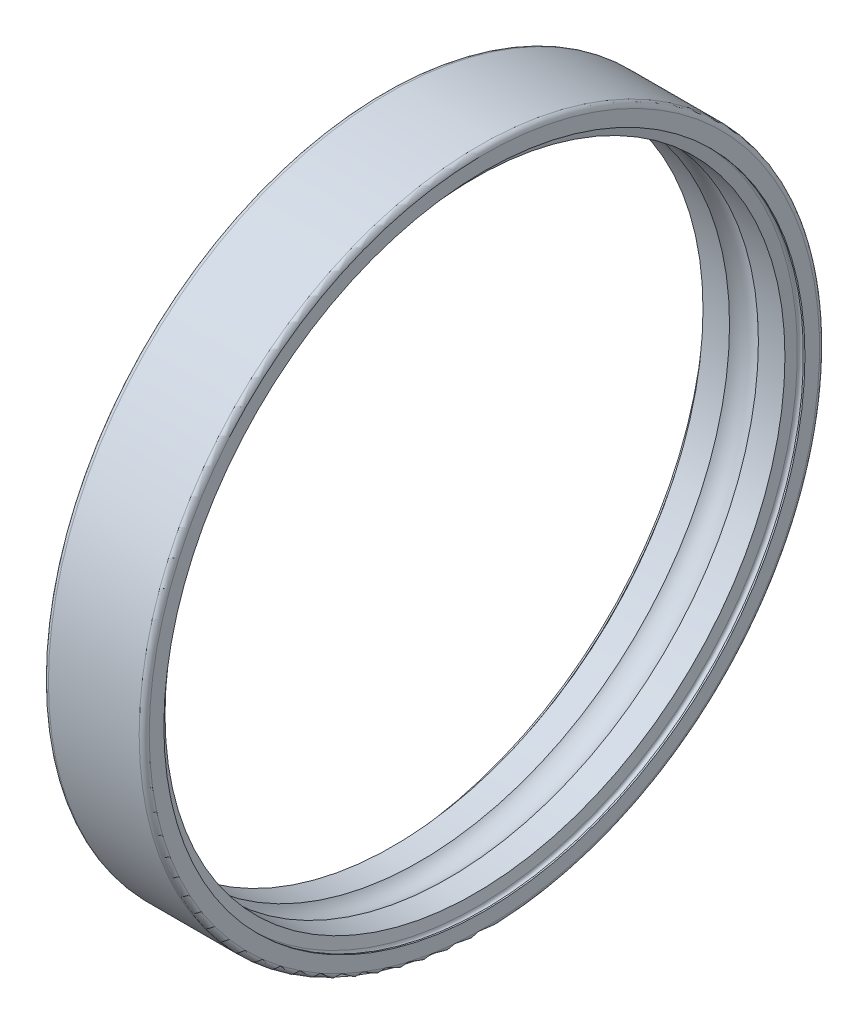
ISO-10303-21;
HEADER;
FILE_DESCRIPTION(('STEP AP214'),'2;1');
FILE_NAME('part.step','',(''),(''),'','','');
FILE_SCHEMA(('AUTOMOTIVE_DESIGN { 1 0 10303 214 1 1 1 1 }'));
ENDSEC;
DATA;
#1=APPLICATION_CONTEXT('core data for automotive mechanical design processes');
#2=APPLICATION_PROTOCOL_DEFINITION('international standard','automotive_design',2000,#1);
#3=PRODUCT_CONTEXT('',#1,'mechanical');
#4=PRODUCT('Part','Part','',(#3));
#5=PRODUCT_RELATED_PRODUCT_CATEGORY('part','',(#4));
#6=PRODUCT_DEFINITION_FORMATION('','',#4);
#7=PRODUCT_DEFINITION_CONTEXT('part definition',#1,'design');
#8=PRODUCT_DEFINITION('design','',#6,#7);
#9=PRODUCT_DEFINITION_SHAPE('','',#8);
#10=(LENGTH_UNIT() NAMED_UNIT(*) SI_UNIT(.MILLI.,.METRE.));
#11=(NAMED_UNIT(*) PLANE_ANGLE_UNIT() SI_UNIT($,.RADIAN.));
#12=(NAMED_UNIT(*) SI_UNIT($,.STERADIAN.) SOLID_ANGLE_UNIT());
#13=UNCERTAINTY_MEASURE_WITH_UNIT(LENGTH_MEASURE(1.E-05),#10,'distance_accuracy_value','');
#14=(GEOMETRIC_REPRESENTATION_CONTEXT(3) GLOBAL_UNCERTAINTY_ASSIGNED_CONTEXT((#13)) GLOBAL_UNIT_ASSIGNED_CONTEXT((#10,
#11,#12)) REPRESENTATION_CONTEXT('',''));
#15=CARTESIAN_POINT('',(0.,0.,0.));
#16=DIRECTION('',(0.,0.,1.));
#17=DIRECTION('',(1.,0.,0.));
#18=AXIS2_PLACEMENT_3D('',#15,#16,#17);
#19=CARTESIAN_POINT('',(0.,-13.5470653717791,-13.3));
#20=DIRECTION('',(-1.,0.,0.));
#21=DIRECTION('',(0.,0.,1.));
#22=AXIS2_PLACEMENT_3D('',#19,#20,#21);
#23=PLANE('',#22);
#24=CARTESIAN_POINT('',(0.,0.,0.));
#25=DIRECTION('',(-1.,0.,0.));
#26=DIRECTION('',(0.,0.,-1.));
#27=AXIS2_PLACEMENT_3D('',#24,#25,#26);
#28=CIRCLE('',#27,13.3);
#29=CARTESIAN_POINT('',(0.,0.,-13.3));
#30=VERTEX_POINT('',#29);
#31=EDGE_CURVE('E62',#30,#30,#28,.F.);
#32=ORIENTED_EDGE('',*,*,#31,.F.);
#33=EDGE_LOOP('',(#32));
#34=FACE_BOUND('',#33,.T.);
#35=CARTESIAN_POINT('',(0.,0.,0.));
#36=DIRECTION('',(1.,0.,0.));
#37=DIRECTION('',(0.,0.,1.));
#38=AXIS2_PLACEMENT_3D('',#35,#36,#37);
#39=CIRCLE('',#38,12.72);
#40=CARTESIAN_POINT('',(0.,0.,12.72));
#41=VERTEX_POINT('',#40);
#42=EDGE_CURVE('E59',#41,#41,#39,.T.);
#43=ORIENTED_EDGE('',*,*,#42,.T.);
#44=EDGE_LOOP('',(#43));
#45=FACE_BOUND('',#44,.T.);
#46=ADVANCED_FACE('F15',(#34,#45),#23,.T.);
#47=CARTESIAN_POINT('',(4.,-13.5470653486385,13.3));
#48=DIRECTION('',(1.,0.,0.));
#49=DIRECTION('',(0.,0.,-1.));
#50=AXIS2_PLACEMENT_3D('',#47,#48,#49);
#51=PLANE('',#50);
#52=CARTESIAN_POINT('',(4.,0.,0.));
#53=DIRECTION('',(1.,0.,0.));
#54=DIRECTION('',(0.,-1.16857340846483E-09,1.));
#55=AXIS2_PLACEMENT_3D('',#52,#53,#54);
#56=CIRCLE('',#55,13.3000000098838);
#57=CARTESIAN_POINT('',(4.,-1.55420263441322E-08,13.3000000098838));
#58=VERTEX_POINT('',#57);
#59=EDGE_CURVE('E56',#58,#58,#56,.T.);
#60=ORIENTED_EDGE('',*,*,#59,.T.);
#61=EDGE_LOOP('',(#60));
#62=FACE_BOUND('',#61,.T.);
#63=CARTESIAN_POINT('',(4.,0.,0.));
#64=DIRECTION('',(-1.,0.,0.));
#65=DIRECTION('',(0.,0.,-1.));
#66=AXIS2_PLACEMENT_3D('',#63,#64,#65);
#67=CIRCLE('',#66,12.72);
#68=CARTESIAN_POINT('',(4.,0.,-12.72));
#69=VERTEX_POINT('',#68);
#70=EDGE_CURVE('E53',#69,#69,#67,.F.);
#71=ORIENTED_EDGE('',*,*,#70,.F.);
#72=EDGE_LOOP('',(#71));
#73=FACE_BOUND('',#72,.T.);
#74=ADVANCED_FACE('F70',(#62,#73),#51,.T.);
#75=CARTESIAN_POINT('',(50.,0.,0.));
#76=DIRECTION('',(1.,0.,0.));
#77=DIRECTION('',(0.,0.,1.));
#78=AXIS2_PLACEMENT_3D('',#75,#76,#77);
#79=CYLINDRICAL_SURFACE('',#78,12.72);
#80=CARTESIAN_POINT('',(0.0599999999999952,0.,0.));
#81=DIRECTION('',(1.,0.,0.));
#82=DIRECTION('',(0.,0.,1.));
#83=AXIS2_PLACEMENT_3D('',#80,#81,#82);
#84=CIRCLE('',#83,12.72);
#85=CARTESIAN_POINT('',(0.0599999999999952,0.,12.72));
#86=VERTEX_POINT('',#85);
#87=EDGE_CURVE('E50',#86,#86,#84,.T.);
#88=ORIENTED_EDGE('',*,*,#87,.T.);
#89=EDGE_LOOP('',(#88));
#90=FACE_BOUND('',#89,.T.);
#91=ORIENTED_EDGE('',*,*,#42,.F.);
#92=EDGE_LOOP('',(#91));
#93=FACE_BOUND('',#92,.T.);
#94=ADVANCED_FACE('F74',(#90,#93),#79,.F.);
#95=CARTESIAN_POINT('',(0.18,0.,0.));
#96=DIRECTION('',(1.,0.,0.));
#97=DIRECTION('',(0.,0.,1.));
#98=AXIS2_PLACEMENT_3D('',#95,#96,#97);
#99=TOROIDAL_SURFACE('',#98,12.72,0.12);
#100=ORIENTED_EDGE('',*,*,#87,.F.);
#101=EDGE_LOOP('',(#100));
#102=FACE_BOUND('',#101,.T.);
#103=CARTESIAN_POINT('',(0.3,0.,0.));
#104=DIRECTION('',(1.,0.,0.));
#105=DIRECTION('',(0.,-1.92331361607703E-10,1.));
#106=AXIS2_PLACEMENT_3D('',#103,#104,#105);
#107=CIRCLE('',#106,12.72);
#108=CARTESIAN_POINT('',(0.3,-2.44645491964999E-09,12.72));
#109=VERTEX_POINT('',#108);
#110=EDGE_CURVE('E47',#109,#109,#107,.T.);
#111=ORIENTED_EDGE('',*,*,#110,.T.);
#112=EDGE_LOOP('',(#111));
#113=FACE_BOUND('',#112,.T.);
#114=ADVANCED_FACE('F76',(#102,#113),#99,.F.);
#115=CARTESIAN_POINT('',(0.299999999999999,0.,0.));
#116=DIRECTION('',(-1.,0.,0.));
#117=DIRECTION('',(0.,0.,-1.));
#118=AXIS2_PLACEMENT_3D('',#115,#116,#117);
#119=CONICAL_SURFACE('',#118,12.72,1.39626340159545);
#120=ORIENTED_EDGE('',*,*,#110,.F.);
#121=EDGE_LOOP('',(#120));
#122=FACE_BOUND('',#121,.T.);
#123=CARTESIAN_POINT('',(0.37405733189756,0.,0.));
#124=DIRECTION('',(1.,0.,0.));
#125=DIRECTION('',(0.,0.,1.));
#126=AXIS2_PLACEMENT_3D('',#123,#124,#125);
#127=CIRCLE('',#126,12.3);
#128=CARTESIAN_POINT('',(0.37405733189756,0.,12.3));
#129=VERTEX_POINT('',#128);
#130=EDGE_CURVE('E44',#129,#129,#127,.T.);
#131=ORIENTED_EDGE('',*,*,#130,.T.);
#132=EDGE_LOOP('',(#131));
#133=FACE_BOUND('',#132,.T.);
#134=ADVANCED_FACE('F84',(#122,#133),#119,.F.);
#135=CARTESIAN_POINT('',(50.,0.,0.));
#136=DIRECTION('',(1.,0.,0.));
#137=DIRECTION('',(0.,0.,1.));
#138=AXIS2_PLACEMENT_3D('',#135,#136,#137);
#139=CYLINDRICAL_SURFACE('',#138,12.3);
#140=CARTESIAN_POINT('',(1.42734303461853,0.,0.));
#141=DIRECTION('',(1.,0.,0.));
#142=DIRECTION('',(0.,0.,1.));
#143=AXIS2_PLACEMENT_3D('',#140,#141,#142);
#144=CIRCLE('',#143,12.3);
#145=CARTESIAN_POINT('',(1.42734303461853,0.,12.3));
#146=VERTEX_POINT('',#145);
#147=EDGE_CURVE('E41',#146,#146,#144,.T.);
#148=ORIENTED_EDGE('',*,*,#147,.T.);
#149=EDGE_LOOP('',(#148));
#150=FACE_BOUND('',#149,.T.);
#151=ORIENTED_EDGE('',*,*,#130,.F.);
#152=EDGE_LOOP('',(#151));
#153=FACE_BOUND('',#152,.T.);
#154=ADVANCED_FACE('F92',(#150,#153),#139,.F.);
#155=CARTESIAN_POINT('',(2.,0.,0.));
#156=DIRECTION('',(1.,0.,0.));
#157=DIRECTION('',(0.,0.,1.));
#158=AXIS2_PLACEMENT_3D('',#155,#156,#157);
#159=TOROIDAL_SURFACE('',#158,11.75,0.793999999999892);
#160=ORIENTED_EDGE('',*,*,#147,.F.);
#161=EDGE_LOOP('',(#160));
#162=FACE_BOUND('',#161,.T.);
#163=CARTESIAN_POINT('',(2.57265696538144,0.,0.));
#164=DIRECTION('',(1.,0.,0.));
#165=DIRECTION('',(0.,-1.92350901532937E-10,1.));
#166=AXIS2_PLACEMENT_3D('',#163,#164,#165);
#167=CIRCLE('',#166,12.3);
#168=CARTESIAN_POINT('',(2.57265696538144,-2.36591608885511E-09,12.3));
#169=VERTEX_POINT('',#168);
#170=EDGE_CURVE('E38',#169,#169,#167,.T.);
#171=ORIENTED_EDGE('',*,*,#170,.T.);
#172=EDGE_LOOP('',(#171));
#173=FACE_BOUND('',#172,.T.);
#174=ADVANCED_FACE('F96',(#162,#173),#159,.F.);
#175=CARTESIAN_POINT('',(50.,0.,0.));
#176=DIRECTION('',(1.,0.,0.));
#177=DIRECTION('',(0.,0.,1.));
#178=AXIS2_PLACEMENT_3D('',#175,#176,#177);
#179=CYLINDRICAL_SURFACE('',#178,12.3);
#180=CARTESIAN_POINT('',(3.6259426681024,0.,0.));
#181=DIRECTION('',(1.,0.,0.));
#182=DIRECTION('',(0.,0.,1.));
#183=AXIS2_PLACEMENT_3D('',#180,#181,#182);
#184=CIRCLE('',#183,12.3);
#185=CARTESIAN_POINT('',(3.6259426681024,0.,12.3));
#186=VERTEX_POINT('',#185);
#187=EDGE_CURVE('E35',#186,#186,#184,.T.);
#188=ORIENTED_EDGE('',*,*,#187,.T.);
#189=EDGE_LOOP('',(#188));
#190=FACE_BOUND('',#189,.T.);
#191=ORIENTED_EDGE('',*,*,#170,.F.);
#192=EDGE_LOOP('',(#191));
#193=FACE_BOUND('',#192,.T.);
#194=ADVANCED_FACE('F100',(#190,#193),#179,.F.);
#195=CARTESIAN_POINT('',(3.7,0.,0.));
#196=DIRECTION('',(1.,0.,0.));
#197=DIRECTION('',(0.,0.,1.));
#198=AXIS2_PLACEMENT_3D('',#195,#196,#197);
#199=CONICAL_SURFACE('',#198,12.72,1.39626340159536);
#200=CARTESIAN_POINT('',(3.7,0.,0.));
#201=DIRECTION('',(1.,0.,0.));
#202=DIRECTION('',(0.,0.,1.));
#203=AXIS2_PLACEMENT_3D('',#200,#201,#202);
#204=CIRCLE('',#203,12.72);
#205=CARTESIAN_POINT('',(3.7,0.,12.72));
#206=VERTEX_POINT('',#205);
#207=EDGE_CURVE('E30',#206,#206,#204,.T.);
#208=ORIENTED_EDGE('',*,*,#207,.T.);
#209=EDGE_LOOP('',(#208));
#210=FACE_BOUND('',#209,.T.);
#211=ORIENTED_EDGE('',*,*,#187,.F.);
#212=EDGE_LOOP('',(#211));
#213=FACE_BOUND('',#212,.T.);
#214=ADVANCED_FACE('F104',(#210,#213),#199,.F.);
#215=CARTESIAN_POINT('',(3.82,0.,0.));
#216=DIRECTION('',(1.,0.,0.));
#217=DIRECTION('',(0.,7.69376684924136E-10,1.));
#218=AXIS2_PLACEMENT_3D('',#215,#216,#217);
#219=TOROIDAL_SURFACE('',#218,12.72,0.12);
#220=ORIENTED_EDGE('',*,*,#207,.F.);
#221=EDGE_LOOP('',(#220));
#222=FACE_BOUND('',#221,.T.);
#223=CARTESIAN_POINT('',(3.94,0.,0.));
#224=DIRECTION('',(1.,0.,0.));
#225=DIRECTION('',(0.,0.,1.));
#226=AXIS2_PLACEMENT_3D('',#223,#224,#225);
#227=CIRCLE('',#226,12.72);
#228=CARTESIAN_POINT('',(3.94,0.,12.72));
#229=VERTEX_POINT('',#228);
#230=EDGE_CURVE('E26',#229,#229,#227,.T.);
#231=ORIENTED_EDGE('',*,*,#230,.T.);
#232=EDGE_LOOP('',(#231));
#233=FACE_BOUND('',#232,.T.);
#234=ADVANCED_FACE('F108',(#222,#233),#219,.F.);
#235=CARTESIAN_POINT('',(50.,0.,0.));
#236=DIRECTION('',(1.,0.,0.));
#237=DIRECTION('',(0.,0.,1.));
#238=AXIS2_PLACEMENT_3D('',#235,#236,#237);
#239=CYLINDRICAL_SURFACE('',#238,12.72);
#240=ORIENTED_EDGE('',*,*,#70,.T.);
#241=EDGE_LOOP('',(#240));
#242=FACE_BOUND('',#241,.T.);
#243=ORIENTED_EDGE('',*,*,#230,.F.);
#244=EDGE_LOOP('',(#243));
#245=FACE_BOUND('',#244,.T.);
#246=ADVANCED_FACE('F112',(#242,#245),#239,.F.);
#247=CARTESIAN_POINT('',(3.79999999999946,0.,0.));
#248=DIRECTION('',(1.,0.,0.));
#249=DIRECTION('',(0.,0.,1.));
#250=AXIS2_PLACEMENT_3D('',#247,#248,#249);
#251=TOROIDAL_SURFACE('',#250,13.2999999999995,0.20000000000054);
#252=CARTESIAN_POINT('',(3.79999999999946,0.,0.));
#253=DIRECTION('',(1.,0.,0.));
#254=DIRECTION('',(0.,0.,1.));
#255=AXIS2_PLACEMENT_3D('',#252,#253,#254);
#256=CIRCLE('',#255,13.5);
#257=CARTESIAN_POINT('',(3.79999999999946,0.,13.5));
#258=VERTEX_POINT('',#257);
#259=EDGE_CURVE('E22',#258,#258,#256,.T.);
#260=ORIENTED_EDGE('',*,*,#259,.T.);
#261=EDGE_LOOP('',(#260));
#262=FACE_BOUND('',#261,.T.);
#263=ORIENTED_EDGE('',*,*,#59,.F.);
#264=EDGE_LOOP('',(#263));
#265=FACE_BOUND('',#264,.T.);
#266=ADVANCED_FACE('F116',(#262,#265),#251,.T.);
#267=CARTESIAN_POINT('',(50.,0.,0.));
#268=DIRECTION('',(1.,0.,0.));
#269=DIRECTION('',(0.,0.,1.));
#270=AXIS2_PLACEMENT_3D('',#267,#268,#269);
#271=CYLINDRICAL_SURFACE('',#270,13.5);
#272=CARTESIAN_POINT('',(0.200000000000003,0.,0.));
#273=DIRECTION('',(1.,0.,0.));
#274=DIRECTION('',(0.,0.,1.));
#275=AXIS2_PLACEMENT_3D('',#272,#273,#274);
#276=CIRCLE('',#275,13.5);
#277=CARTESIAN_POINT('',(0.200000000000003,0.,13.5));
#278=VERTEX_POINT('',#277);
#279=EDGE_CURVE('E10',#278,#278,#276,.T.);
#280=ORIENTED_EDGE('',*,*,#279,.T.);
#281=EDGE_LOOP('',(#280));
#282=FACE_BOUND('',#281,.T.);
#283=ORIENTED_EDGE('',*,*,#259,.F.);
#284=EDGE_LOOP('',(#283));
#285=FACE_BOUND('',#284,.T.);
#286=ADVANCED_FACE('F119',(#282,#285),#271,.T.);
#287=CARTESIAN_POINT('',(0.200000000000525,0.,0.));
#288=DIRECTION('',(1.,0.,0.));
#289=DIRECTION('',(0.,0.,1.));
#290=AXIS2_PLACEMENT_3D('',#287,#288,#289);
#291=TOROIDAL_SURFACE('',#290,13.2999999999995,0.200000000000524);
#292=ORIENTED_EDGE('',*,*,#31,.T.);
#293=EDGE_LOOP('',(#292));
#294=FACE_BOUND('',#293,.T.);
#295=ORIENTED_EDGE('',*,*,#279,.F.);
#296=EDGE_LOOP('',(#295));
#297=FACE_BOUND('',#296,.T.);
#298=ADVANCED_FACE('F17',(#294,#297),#291,.T.);
#299=CLOSED_SHELL('',(#46,#74,#94,#114,#134,#154,#174,#194,#214,#234,#246,#266,#286,#298));
#300=MANIFOLD_SOLID_BREP('B1',#299);
#301=ADVANCED_BREP_SHAPE_REPRESENTATION('',(#18,#300),#14);
#302=SHAPE_DEFINITION_REPRESENTATION(#9,#301);
ENDSEC;
END-ISO-10303-21;
